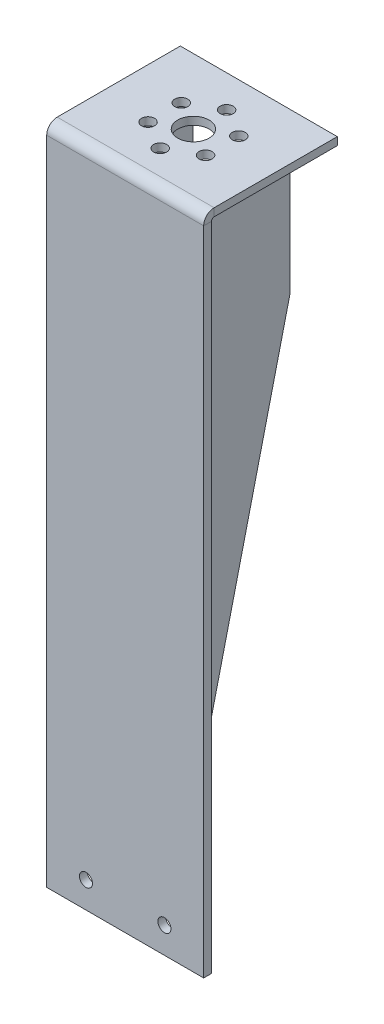
ISO-10303-21;
HEADER;
FILE_DESCRIPTION(('STEP AP214'),'2;1');
FILE_NAME('part.step','',(''),(''),'','','');
FILE_SCHEMA(('AUTOMOTIVE_DESIGN { 1 0 10303 214 1 1 1 1 }'));
ENDSEC;
DATA;
#1=APPLICATION_CONTEXT('core data for automotive mechanical design processes');
#2=APPLICATION_PROTOCOL_DEFINITION('international standard','automotive_design',2000,#1);
#3=PRODUCT_CONTEXT('',#1,'mechanical');
#4=PRODUCT('Part','Part','',(#3));
#5=PRODUCT_RELATED_PRODUCT_CATEGORY('part','',(#4));
#6=PRODUCT_DEFINITION_FORMATION('','',#4);
#7=PRODUCT_DEFINITION_CONTEXT('part definition',#1,'design');
#8=PRODUCT_DEFINITION('design','',#6,#7);
#9=PRODUCT_DEFINITION_SHAPE('','',#8);
#10=(LENGTH_UNIT() NAMED_UNIT(*) SI_UNIT(.MILLI.,.METRE.));
#11=(NAMED_UNIT(*) PLANE_ANGLE_UNIT() SI_UNIT($,.RADIAN.));
#12=(NAMED_UNIT(*) SI_UNIT($,.STERADIAN.) SOLID_ANGLE_UNIT());
#13=UNCERTAINTY_MEASURE_WITH_UNIT(LENGTH_MEASURE(1.E-05),#10,'distance_accuracy_value','');
#14=(GEOMETRIC_REPRESENTATION_CONTEXT(3) GLOBAL_UNCERTAINTY_ASSIGNED_CONTEXT((#13)) GLOBAL_UNIT_ASSIGNED_CONTEXT((#10,
#11,#12)) REPRESENTATION_CONTEXT('',''));
#15=CARTESIAN_POINT('',(0.,0.,0.));
#16=DIRECTION('',(0.,0.,1.));
#17=DIRECTION('',(1.,0.,0.));
#18=AXIS2_PLACEMENT_3D('',#15,#16,#17);
#19=CARTESIAN_POINT('',(0.,100.,-40.));
#20=DIRECTION('',(0.,0.,1.));
#21=DIRECTION('',(0.,-1.,0.));
#22=AXIS2_PLACEMENT_3D('',#19,#20,#21);
#23=PLANE('',#22);
#24=DIRECTION('',(0.,-1.,0.));
#25=VECTOR('',#24,1.);
#26=CARTESIAN_POINT('',(-17.,152.497618993627,-40.));
#27=LINE('',#26,#25);
#28=CARTESIAN_POINT('',(-17.,99.9999999999999,-40.));
#29=VERTEX_POINT('',#28);
#30=CARTESIAN_POINT('',(-17.,50.,-40.));
#31=VERTEX_POINT('',#30);
#32=EDGE_CURVE('E176',#29,#31,#27,.T.);
#33=ORIENTED_EDGE('',*,*,#32,.T.);
#34=DIRECTION('',(1.,0.,0.));
#35=VECTOR('',#34,1.);
#36=CARTESIAN_POINT('',(0.,50.0000000000001,-40.));
#37=LINE('',#36,#35);
#38=CARTESIAN_POINT('',(-20.,50.,-40.));
#39=VERTEX_POINT('',#38);
#40=EDGE_CURVE('E221',#39,#31,#37,.T.);
#41=ORIENTED_EDGE('',*,*,#40,.F.);
#42=DIRECTION('',(0.,1.,0.));
#43=VECTOR('',#42,1.);
#44=CARTESIAN_POINT('',(-20.,-23.5,-40.));
#45=LINE('',#44,#43);
#46=CARTESIAN_POINT('',(-20.,99.9999999999999,-40.));
#47=VERTEX_POINT('',#46);
#48=EDGE_CURVE('E214',#47,#39,#45,.F.);
#49=ORIENTED_EDGE('',*,*,#48,.F.);
#50=DIRECTION('',(1.,0.,0.));
#51=VECTOR('',#50,1.);
#52=CARTESIAN_POINT('',(0.,99.9999999999999,-40.));
#53=LINE('',#52,#51);
#54=EDGE_CURVE('E237',#29,#47,#53,.F.);
#55=ORIENTED_EDGE('',*,*,#54,.F.);
#56=EDGE_LOOP('',(#33,#41,#49,#55));
#57=FACE_BOUND('',#56,.T.);
#58=ADVANCED_FACE('F39',(#57),#23,.F.);
#59=CARTESIAN_POINT('',(0.,-74.9999999999999,-10.));
#60=DIRECTION('',(0.,1.,0.));
#61=DIRECTION('',(0.,0.,1.));
#62=AXIS2_PLACEMENT_3D('',#59,#60,#61);
#63=PLANE('',#62);
#64=DIRECTION('',(0.,0.,-1.));
#65=VECTOR('',#64,1.);
#66=CARTESIAN_POINT('',(-17.,-74.9999999999999,-40.));
#67=LINE('',#66,#65);
#68=CARTESIAN_POINT('',(-17.,-74.9999999999999,0.));
#69=VERTEX_POINT('',#68);
#70=CARTESIAN_POINT('',(-17.,-74.9999999999999,-10.));
#71=VERTEX_POINT('',#70);
#72=EDGE_CURVE('E192',#69,#71,#67,.T.);
#73=ORIENTED_EDGE('',*,*,#72,.F.);
#74=DIRECTION('',(-1.,0.,0.));
#75=VECTOR('',#74,1.);
#76=CARTESIAN_POINT('',(0.,-74.9999999999999,0.));
#77=LINE('',#76,#75);
#78=CARTESIAN_POINT('',(-20.,-74.9999999999999,0.));
#79=VERTEX_POINT('',#78);
#80=EDGE_CURVE('E187',#79,#69,#77,.F.);
#81=ORIENTED_EDGE('',*,*,#80,.F.);
#82=DIRECTION('',(0.,0.,-1.));
#83=VECTOR('',#82,1.);
#84=CARTESIAN_POINT('',(-20.,-74.9999999999999,-22.5365045915064));
#85=LINE('',#84,#83);
#86=CARTESIAN_POINT('',(-20.,-74.9999999999999,-10.));
#87=VERTEX_POINT('',#86);
#88=EDGE_CURVE('E203',#87,#79,#85,.F.);
#89=ORIENTED_EDGE('',*,*,#88,.F.);
#90=DIRECTION('',(1.,0.,0.));
#91=VECTOR('',#90,1.);
#92=CARTESIAN_POINT('',(0.,-74.9999999999999,-10.));
#93=LINE('',#92,#91);
#94=EDGE_CURVE('E225',#87,#71,#93,.T.);
#95=ORIENTED_EDGE('',*,*,#94,.T.);
#96=EDGE_LOOP('',(#73,#81,#89,#95));
#97=FACE_BOUND('',#96,.T.);
#98=ADVANCED_FACE('F368',(#97),#63,.F.);
#99=CARTESIAN_POINT('',(0.,50.0000000000001,-40.));
#100=DIRECTION('',(0.,0.233372952475324,0.972387301980517));
#101=DIRECTION('',(0.,-0.972387301980517,0.233372952475324));
#102=AXIS2_PLACEMENT_3D('',#99,#100,#101);
#103=PLANE('',#102);
#104=DIRECTION('',(0.,-0.972387301980517,0.233372952475324));
#105=VECTOR('',#104,1.);
#106=CARTESIAN_POINT('',(-17.,50.0000000000001,-40.));
#107=LINE('',#106,#105);
#108=EDGE_CURVE('E12',#71,#31,#107,.F.);
#109=ORIENTED_EDGE('',*,*,#108,.F.);
#110=ORIENTED_EDGE('',*,*,#94,.F.);
#111=DIRECTION('',(0.,-0.972387301980517,0.233372952475324));
#112=VECTOR('',#111,1.);
#113=CARTESIAN_POINT('',(-20.,50.0000000000001,-40.));
#114=LINE('',#113,#112);
#115=EDGE_CURVE('E216',#39,#87,#114,.T.);
#116=ORIENTED_EDGE('',*,*,#115,.F.);
#117=ORIENTED_EDGE('',*,*,#40,.T.);
#118=EDGE_LOOP('',(#109,#110,#116,#117));
#119=FACE_BOUND('',#118,.T.);
#120=ADVANCED_FACE('F371',(#119),#103,.F.);
#121=CARTESIAN_POINT('',(60.2031665020761,99.,-1.));
#122=DIRECTION('',(-1.,0.,0.));
#123=DIRECTION('',(0.,-1.,0.));
#124=AXIS2_PLACEMENT_3D('',#121,#122,#123);
#125=CYLINDRICAL_SURFACE('',#124,1.);
#126=CARTESIAN_POINT('',(-20.,99.,-1.));
#127=DIRECTION('',(1.,0.,0.));
#128=DIRECTION('',(0.,0.,-1.));
#129=AXIS2_PLACEMENT_3D('',#126,#127,#128);
#130=CIRCLE('',#129,1.);
#131=CARTESIAN_POINT('',(-20.,99.0000000000001,0.));
#132=VERTEX_POINT('',#131);
#133=CARTESIAN_POINT('',(-20.,100.,-0.999999999999994));
#134=VERTEX_POINT('',#133);
#135=EDGE_CURVE('E311',#132,#134,#130,.F.);
#136=ORIENTED_EDGE('',*,*,#135,.F.);
#137=DIRECTION('',(-1.,0.,0.));
#138=VECTOR('',#137,1.);
#139=CARTESIAN_POINT('',(0.,99.0000000000001,0.));
#140=LINE('',#139,#138);
#141=CARTESIAN_POINT('',(-30.,99.0000000000001,0.));
#142=VERTEX_POINT('',#141);
#143=EDGE_CURVE('E248',#132,#142,#140,.T.);
#144=ORIENTED_EDGE('',*,*,#143,.T.);
#145=CARTESIAN_POINT('',(-30.,99.,-1.));
#146=DIRECTION('',(-1.,0.,0.));
#147=DIRECTION('',(0.,-1.,0.));
#148=AXIS2_PLACEMENT_3D('',#145,#146,#147);
#149=CIRCLE('',#148,1.);
#150=CARTESIAN_POINT('',(-30.,100.,-1.));
#151=VERTEX_POINT('',#150);
#152=EDGE_CURVE('E245',#151,#142,#149,.F.);
#153=ORIENTED_EDGE('',*,*,#152,.F.);
#154=DIRECTION('',(-1.,0.,0.));
#155=VECTOR('',#154,1.);
#156=CARTESIAN_POINT('',(0.,100.,-1.00000000000001));
#157=LINE('',#156,#155);
#158=EDGE_CURVE('E305',#134,#151,#157,.T.);
#159=ORIENTED_EDGE('',*,*,#158,.F.);
#160=EDGE_LOOP('',(#136,#144,#153,#159));
#161=FACE_BOUND('',#160,.T.);
#162=ADVANCED_FACE('F385',(#161),#125,.F.);
#163=CARTESIAN_POINT('',(0.,100.,101.926990816987));
#164=DIRECTION('',(0.,1.,0.));
#165=DIRECTION('',(1.,0.,0.));
#166=AXIS2_PLACEMENT_3D('',#163,#164,#165);
#167=PLANE('',#166);
#168=CARTESIAN_POINT('',(10.9985226280623,99.9999999999999,-29.4230091830128));
#169=DIRECTION('',(0.,1.,0.));
#170=DIRECTION('',(-0.866025403784433,0.,0.50000000000001));
#171=AXIS2_PLACEMENT_3D('',#168,#169,#170);
#172=CIRCLE('',#171,2.5);
#173=CARTESIAN_POINT('',(8.83345911860118,99.9999999999999,-28.1730091830128));
#174=VERTEX_POINT('',#173);
#175=EDGE_CURVE('E744',#174,#174,#172,.T.);
#176=ORIENTED_EDGE('',*,*,#175,.T.);
#177=EDGE_LOOP('',(#176));
#178=FACE_BOUND('',#177,.T.);
#179=CARTESIAN_POINT('',(10.9985226280624,100.,-16.7230091830128));
#180=DIRECTION('',(0.,1.,0.));
#181=DIRECTION('',(-0.866025403784443,0.,-0.499999999999992));
#182=AXIS2_PLACEMENT_3D('',#179,#180,#181);
#183=CIRCLE('',#182,2.5);
#184=CARTESIAN_POINT('',(8.83345911860128,100.,-17.9730091830128));
#185=VERTEX_POINT('',#184);
#186=EDGE_CURVE('E748',#185,#185,#183,.T.);
#187=ORIENTED_EDGE('',*,*,#186,.T.);
#188=EDGE_LOOP('',(#187));
#189=FACE_BOUND('',#188,.T.);
#190=CARTESIAN_POINT('',(0.,100.,-10.3730091830127));
#191=DIRECTION('',(0.,1.,0.));
#192=DIRECTION('',(0.,0.,-1.));
#193=AXIS2_PLACEMENT_3D('',#190,#191,#192);
#194=CIRCLE('',#193,2.5);
#195=CARTESIAN_POINT('',(0.,100.,-12.8730091830127));
#196=VERTEX_POINT('',#195);
#197=EDGE_CURVE('E757',#196,#196,#194,.T.);
#198=ORIENTED_EDGE('',*,*,#197,.T.);
#199=EDGE_LOOP('',(#198));
#200=FACE_BOUND('',#199,.T.);
#201=CARTESIAN_POINT('',(-10.9985226280624,100.,-16.7230091830127));
#202=DIRECTION('',(0.,1.,0.));
#203=DIRECTION('',(0.866025403784436,0.,-0.500000000000004));
#204=AXIS2_PLACEMENT_3D('',#201,#202,#203);
#205=CIRCLE('',#204,2.5);
#206=CARTESIAN_POINT('',(-8.83345911860128,100.,-17.9730091830127));
#207=VERTEX_POINT('',#206);
#208=EDGE_CURVE('E763',#207,#207,#205,.T.);
#209=ORIENTED_EDGE('',*,*,#208,.T.);
#210=EDGE_LOOP('',(#209));
#211=FACE_BOUND('',#210,.T.);
#212=CARTESIAN_POINT('',(-10.9985226280624,99.9999999999999,-29.4230091830127));
#213=DIRECTION('',(0.,1.,0.));
#214=DIRECTION('',(0.86602540378444,0.,0.499999999999998));
#215=AXIS2_PLACEMENT_3D('',#212,#213,#214);
#216=CIRCLE('',#215,2.5);
#217=CARTESIAN_POINT('',(-8.83345911860131,99.9999999999999,-28.1730091830127));
#218=VERTEX_POINT('',#217);
#219=EDGE_CURVE('E769',#218,#218,#216,.T.);
#220=ORIENTED_EDGE('',*,*,#219,.T.);
#221=EDGE_LOOP('',(#220));
#222=FACE_BOUND('',#221,.T.);
#223=CARTESIAN_POINT('',(0.,99.9999999999999,-35.7730091830127));
#224=DIRECTION('',(0.,1.,0.));
#225=DIRECTION('',(0.,0.,1.));
#226=AXIS2_PLACEMENT_3D('',#223,#224,#225);
#227=CIRCLE('',#226,2.5);
#228=CARTESIAN_POINT('',(0.,99.9999999999999,-33.2730091830127));
#229=VERTEX_POINT('',#228);
#230=EDGE_CURVE('E776',#229,#229,#227,.T.);
#231=ORIENTED_EDGE('',*,*,#230,.T.);
#232=EDGE_LOOP('',(#231));
#233=FACE_BOUND('',#232,.T.);
#234=CARTESIAN_POINT('',(0.,100.,-23.0730091830127));
#235=DIRECTION('',(0.,1.,0.));
#236=DIRECTION('',(0.,0.,1.));
#237=AXIS2_PLACEMENT_3D('',#234,#235,#236);
#238=CIRCLE('',#237,6.);
#239=CARTESIAN_POINT('',(0.,100.,-17.0730091830127));
#240=VERTEX_POINT('',#239);
#241=EDGE_CURVE('E782',#240,#240,#238,.T.);
#242=ORIENTED_EDGE('',*,*,#241,.T.);
#243=EDGE_LOOP('',(#242));
#244=FACE_BOUND('',#243,.T.);
#245=CARTESIAN_POINT('',(30.,100.,-0.999999999999987));
#246=VERTEX_POINT('',#245);
#247=CARTESIAN_POINT('',(20.,100.,-1.00000000000001));
#248=VERTEX_POINT('',#247);
#249=EDGE_CURVE('E306',#246,#248,#157,.T.);
#250=ORIENTED_EDGE('',*,*,#249,.T.);
#251=DIRECTION('',(0.,0.,-1.));
#252=VECTOR('',#251,1.);
#253=CARTESIAN_POINT('',(20.,100.,101.926990816987));
#254=LINE('',#253,#252);
#255=CARTESIAN_POINT('',(20.,99.9999999999999,-40.));
#256=VERTEX_POINT('',#255);
#257=EDGE_CURVE('E62',#248,#256,#254,.T.);
#258=ORIENTED_EDGE('',*,*,#257,.T.);
#259=CARTESIAN_POINT('',(17.,99.9999999999999,-40.));
#260=VERTEX_POINT('',#259);
#261=EDGE_CURVE('E238',#256,#260,#53,.F.);
#262=ORIENTED_EDGE('',*,*,#261,.T.);
#263=DIRECTION('',(0.,0.,1.));
#264=VECTOR('',#263,1.);
#265=CARTESIAN_POINT('',(17.,99.9999999999999,-39.9999999999998));
#266=LINE('',#265,#264);
#267=CARTESIAN_POINT('',(17.,100.,0.));
#268=VERTEX_POINT('',#267);
#269=EDGE_CURVE('E190',#260,#268,#266,.T.);
#270=ORIENTED_EDGE('',*,*,#269,.T.);
#271=DIRECTION('',(-1.,0.,0.));
#272=VECTOR('',#271,1.);
#273=CARTESIAN_POINT('',(17.,100.,0.));
#274=LINE('',#273,#272);
#275=CARTESIAN_POINT('',(-17.,100.,0.));
#276=VERTEX_POINT('',#275);
#277=EDGE_CURVE('E184',#268,#276,#274,.T.);
#278=ORIENTED_EDGE('',*,*,#277,.T.);
#279=DIRECTION('',(0.,0.,-1.));
#280=VECTOR('',#279,1.);
#281=CARTESIAN_POINT('',(-17.,99.9999999999999,-39.9999999999998));
#282=LINE('',#281,#280);
#283=EDGE_CURVE('E170',#276,#29,#282,.T.);
#284=ORIENTED_EDGE('',*,*,#283,.T.);
#285=ORIENTED_EDGE('',*,*,#54,.T.);
#286=DIRECTION('',(0.,0.,-1.));
#287=VECTOR('',#286,1.);
#288=CARTESIAN_POINT('',(-20.,100.,101.926990816987));
#289=LINE('',#288,#287);
#290=EDGE_CURVE('E231',#134,#47,#289,.T.);
#291=ORIENTED_EDGE('',*,*,#290,.F.);
#292=ORIENTED_EDGE('',*,*,#158,.T.);
#293=DIRECTION('',(0.,0.,-1.));
#294=VECTOR('',#293,1.);
#295=CARTESIAN_POINT('',(-30.,100.,101.926990816987));
#296=LINE('',#295,#294);
#297=CARTESIAN_POINT('',(-30.,99.9999999999999,-48.0730091830127));
#298=VERTEX_POINT('',#297);
#299=EDGE_CURVE('E294',#298,#151,#296,.F.);
#300=ORIENTED_EDGE('',*,*,#299,.F.);
#301=DIRECTION('',(1.,0.,0.));
#302=VECTOR('',#301,1.);
#303=CARTESIAN_POINT('',(0.,99.9999999999999,-48.0730091830127));
#304=LINE('',#303,#302);
#305=CARTESIAN_POINT('',(30.,99.9999999999999,-48.0730091830127));
#306=VERTEX_POINT('',#305);
#307=EDGE_CURVE('E291',#306,#298,#304,.F.);
#308=ORIENTED_EDGE('',*,*,#307,.F.);
#309=DIRECTION('',(0.,0.,-1.));
#310=VECTOR('',#309,1.);
#311=CARTESIAN_POINT('',(30.,100.,101.926990816987));
#312=LINE('',#311,#310);
#313=EDGE_CURVE('E256',#246,#306,#312,.T.);
#314=ORIENTED_EDGE('',*,*,#313,.F.);
#315=EDGE_LOOP('',(#250,#258,#262,#270,#278,#284,#285,#291,#292,#300,#308,#314));
#316=FACE_BOUND('',#315,.T.);
#317=ADVANCED_FACE('F189',(#178,#189,#200,#211,#222,#233,#244,#316),#167,.F.);
#318=CARTESIAN_POINT('',(-30.,103.,-48.0730091830127));
#319=DIRECTION('',(-1.,0.,0.));
#320=DIRECTION('',(0.,0.,1.));
#321=AXIS2_PLACEMENT_3D('',#318,#319,#320);
#322=PLANE('',#321);
#323=DIRECTION('',(0.,-1.,0.));
#324=VECTOR('',#323,1.);
#325=CARTESIAN_POINT('',(-30.,103.,-1.));
#326=LINE('',#325,#324);
#327=CARTESIAN_POINT('',(-30.,103.,-1.00000000000001));
#328=VERTEX_POINT('',#327);
#329=EDGE_CURVE('E302',#328,#151,#326,.T.);
#330=ORIENTED_EDGE('',*,*,#329,.F.);
#331=DIRECTION('',(0.,0.,1.));
#332=VECTOR('',#331,1.);
#333=CARTESIAN_POINT('',(-30.,103.,-48.0730091830127));
#334=LINE('',#333,#332);
#335=CARTESIAN_POINT('',(-30.,103.,-48.0730091830127));
#336=VERTEX_POINT('',#335);
#337=EDGE_CURVE('E289',#336,#328,#334,.T.);
#338=ORIENTED_EDGE('',*,*,#337,.F.);
#339=DIRECTION('',(0.,1.,0.));
#340=VECTOR('',#339,1.);
#341=CARTESIAN_POINT('',(-30.,103.,-48.0730091830127));
#342=LINE('',#341,#340);
#343=EDGE_CURVE('E295',#298,#336,#342,.T.);
#344=ORIENTED_EDGE('',*,*,#343,.F.);
#345=ORIENTED_EDGE('',*,*,#299,.T.);
#346=EDGE_LOOP('',(#330,#338,#344,#345));
#347=FACE_BOUND('',#346,.T.);
#348=ADVANCED_FACE('F380',(#347),#322,.T.);
#349=CARTESIAN_POINT('',(30.,103.,-48.0730091830127));
#350=DIRECTION('',(1.,0.,0.));
#351=DIRECTION('',(0.,0.,-1.));
#352=AXIS2_PLACEMENT_3D('',#349,#350,#351);
#353=PLANE('',#352);
#354=DIRECTION('',(0.,1.,0.));
#355=VECTOR('',#354,1.);
#356=CARTESIAN_POINT('',(30.,103.,-1.));
#357=LINE('',#356,#355);
#358=CARTESIAN_POINT('',(30.,103.,-1.));
#359=VERTEX_POINT('',#358);
#360=EDGE_CURVE('E308',#246,#359,#357,.T.);
#361=ORIENTED_EDGE('',*,*,#360,.F.);
#362=ORIENTED_EDGE('',*,*,#313,.T.);
#363=DIRECTION('',(0.,1.,0.));
#364=VECTOR('',#363,1.);
#365=CARTESIAN_POINT('',(30.,103.,-48.0730091830127));
#366=LINE('',#365,#364);
#367=CARTESIAN_POINT('',(30.,103.,-48.0730091830127));
#368=VERTEX_POINT('',#367);
#369=EDGE_CURVE('E298',#306,#368,#366,.T.);
#370=ORIENTED_EDGE('',*,*,#369,.T.);
#371=DIRECTION('',(0.,0.,-1.));
#372=VECTOR('',#371,1.);
#373=CARTESIAN_POINT('',(30.,103.,-48.0730091830127));
#374=LINE('',#373,#372);
#375=EDGE_CURVE('E290',#359,#368,#374,.T.);
#376=ORIENTED_EDGE('',*,*,#375,.F.);
#377=EDGE_LOOP('',(#361,#362,#370,#376));
#378=FACE_BOUND('',#377,.T.);
#379=ADVANCED_FACE('F41',(#378),#353,.T.);
#380=CARTESIAN_POINT('',(-30.,103.,-48.0730091830127));
#381=DIRECTION('',(0.,0.,-1.));
#382=DIRECTION('',(-1.,0.,0.));
#383=AXIS2_PLACEMENT_3D('',#380,#381,#382);
#384=PLANE('',#383);
#385=ORIENTED_EDGE('',*,*,#307,.T.);
#386=ORIENTED_EDGE('',*,*,#343,.T.);
#387=DIRECTION('',(-1.,0.,0.));
#388=VECTOR('',#387,1.);
#389=CARTESIAN_POINT('',(-30.,103.,-48.0730091830127));
#390=LINE('',#389,#388);
#391=EDGE_CURVE('E286',#368,#336,#390,.T.);
#392=ORIENTED_EDGE('',*,*,#391,.F.);
#393=ORIENTED_EDGE('',*,*,#369,.F.);
#394=EDGE_LOOP('',(#385,#386,#392,#393));
#395=FACE_BOUND('',#394,.T.);
#396=ADVANCED_FACE('F449',(#395),#384,.T.);
#397=CARTESIAN_POINT('',(0.,103.,101.926990816987));
#398=DIRECTION('',(0.,1.,0.));
#399=DIRECTION('',(1.,0.,0.));
#400=AXIS2_PLACEMENT_3D('',#397,#398,#399);
#401=PLANE('',#400);
#402=CARTESIAN_POINT('',(10.9985226280623,103.,-29.4230091830129));
#403=DIRECTION('',(0.,1.,0.));
#404=DIRECTION('',(-0.866025403784433,0.,0.50000000000001));
#405=AXIS2_PLACEMENT_3D('',#402,#403,#404);
#406=CIRCLE('',#405,2.5);
#407=CARTESIAN_POINT('',(8.83345911860118,103.,-28.1730091830128));
#408=VERTEX_POINT('',#407);
#409=EDGE_CURVE('E747',#408,#408,#406,.T.);
#410=ORIENTED_EDGE('',*,*,#409,.F.);
#411=EDGE_LOOP('',(#410));
#412=FACE_BOUND('',#411,.T.);
#413=CARTESIAN_POINT('',(10.9985226280624,103.,-16.7230091830128));
#414=DIRECTION('',(0.,1.,0.));
#415=DIRECTION('',(-0.866025403784443,0.,-0.499999999999992));
#416=AXIS2_PLACEMENT_3D('',#413,#414,#415);
#417=CIRCLE('',#416,2.5);
#418=CARTESIAN_POINT('',(8.83345911860128,103.,-17.9730091830128));
#419=VERTEX_POINT('',#418);
#420=EDGE_CURVE('E751',#419,#419,#417,.T.);
#421=ORIENTED_EDGE('',*,*,#420,.F.);
#422=EDGE_LOOP('',(#421));
#423=FACE_BOUND('',#422,.T.);
#424=CARTESIAN_POINT('',(0.,103.,-10.3730091830127));
#425=DIRECTION('',(0.,1.,0.));
#426=DIRECTION('',(0.,0.,-1.));
#427=AXIS2_PLACEMENT_3D('',#424,#425,#426);
#428=CIRCLE('',#427,2.5);
#429=CARTESIAN_POINT('',(0.,103.,-12.8730091830127));
#430=VERTEX_POINT('',#429);
#431=EDGE_CURVE('E760',#430,#430,#428,.T.);
#432=ORIENTED_EDGE('',*,*,#431,.F.);
#433=EDGE_LOOP('',(#432));
#434=FACE_BOUND('',#433,.T.);
#435=CARTESIAN_POINT('',(-10.9985226280624,103.,-16.7230091830127));
#436=DIRECTION('',(0.,1.,0.));
#437=DIRECTION('',(0.866025403784436,0.,-0.500000000000004));
#438=AXIS2_PLACEMENT_3D('',#435,#436,#437);
#439=CIRCLE('',#438,2.5);
#440=CARTESIAN_POINT('',(-8.83345911860128,103.,-17.9730091830127));
#441=VERTEX_POINT('',#440);
#442=EDGE_CURVE('E766',#441,#441,#439,.T.);
#443=ORIENTED_EDGE('',*,*,#442,.F.);
#444=EDGE_LOOP('',(#443));
#445=FACE_BOUND('',#444,.T.);
#446=CARTESIAN_POINT('',(-10.9985226280624,103.,-29.4230091830127));
#447=DIRECTION('',(0.,1.,0.));
#448=DIRECTION('',(0.86602540378444,0.,0.499999999999998));
#449=AXIS2_PLACEMENT_3D('',#446,#447,#448);
#450=CIRCLE('',#449,2.5);
#451=CARTESIAN_POINT('',(-8.83345911860131,103.,-28.1730091830127));
#452=VERTEX_POINT('',#451);
#453=EDGE_CURVE('E772',#452,#452,#450,.T.);
#454=ORIENTED_EDGE('',*,*,#453,.F.);
#455=EDGE_LOOP('',(#454));
#456=FACE_BOUND('',#455,.T.);
#457=CARTESIAN_POINT('',(0.,103.,-35.7730091830127));
#458=DIRECTION('',(0.,1.,0.));
#459=DIRECTION('',(0.,0.,1.));
#460=AXIS2_PLACEMENT_3D('',#457,#458,#459);
#461=CIRCLE('',#460,2.5);
#462=CARTESIAN_POINT('',(0.,103.,-33.2730091830127));
#463=VERTEX_POINT('',#462);
#464=EDGE_CURVE('E775',#463,#463,#461,.T.);
#465=ORIENTED_EDGE('',*,*,#464,.F.);
#466=EDGE_LOOP('',(#465));
#467=FACE_BOUND('',#466,.T.);
#468=CARTESIAN_POINT('',(0.,103.,-23.0730091830127));
#469=DIRECTION('',(0.,1.,0.));
#470=DIRECTION('',(0.,0.,1.));
#471=AXIS2_PLACEMENT_3D('',#468,#469,#470);
#472=CIRCLE('',#471,6.);
#473=CARTESIAN_POINT('',(0.,103.,-17.0730091830127));
#474=VERTEX_POINT('',#473);
#475=EDGE_CURVE('E779',#474,#474,#472,.T.);
#476=ORIENTED_EDGE('',*,*,#475,.F.);
#477=EDGE_LOOP('',(#476));
#478=FACE_BOUND('',#477,.T.);
#479=ORIENTED_EDGE('',*,*,#337,.T.);
#480=DIRECTION('',(-1.,0.,0.));
#481=VECTOR('',#480,1.);
#482=CARTESIAN_POINT('',(0.,103.,-1.));
#483=LINE('',#482,#481);
#484=EDGE_CURVE('E297',#359,#328,#483,.T.);
#485=ORIENTED_EDGE('',*,*,#484,.F.);
#486=ORIENTED_EDGE('',*,*,#375,.T.);
#487=ORIENTED_EDGE('',*,*,#391,.T.);
#488=EDGE_LOOP('',(#479,#485,#486,#487));
#489=FACE_BOUND('',#488,.T.);
#490=ADVANCED_FACE('F424',(#412,#423,#434,#445,#456,#467,#478,#489),#401,.T.);
#491=CARTESIAN_POINT('',(-30.,-150.,3.));
#492=DIRECTION('',(0.,-1.,0.));
#493=DIRECTION('',(1.,0.,0.));
#494=AXIS2_PLACEMENT_3D('',#491,#492,#493);
#495=PLANE('',#494);
#496=DIRECTION('',(0.,0.,1.));
#497=VECTOR('',#496,1.);
#498=CARTESIAN_POINT('',(-30.,-150.,3.));
#499=LINE('',#498,#497);
#500=CARTESIAN_POINT('',(-30.,-150.,0.));
#501=VERTEX_POINT('',#500);
#502=CARTESIAN_POINT('',(-30.,-150.,3.));
#503=VERTEX_POINT('',#502);
#504=EDGE_CURVE('E260',#501,#503,#499,.T.);
#505=ORIENTED_EDGE('',*,*,#504,.F.);
#506=DIRECTION('',(1.,0.,0.));
#507=VECTOR('',#506,1.);
#508=CARTESIAN_POINT('',(0.,-150.,0.));
#509=LINE('',#508,#507);
#510=CARTESIAN_POINT('',(30.,-150.,0.));
#511=VERTEX_POINT('',#510);
#512=EDGE_CURVE('E280',#501,#511,#509,.T.);
#513=ORIENTED_EDGE('',*,*,#512,.T.);
#514=DIRECTION('',(0.,0.,1.));
#515=VECTOR('',#514,1.);
#516=CARTESIAN_POINT('',(30.,-150.,3.));
#517=LINE('',#516,#515);
#518=CARTESIAN_POINT('',(30.,-150.,3.));
#519=VERTEX_POINT('',#518);
#520=EDGE_CURVE('E278',#511,#519,#517,.T.);
#521=ORIENTED_EDGE('',*,*,#520,.T.);
#522=DIRECTION('',(1.,0.,0.));
#523=VECTOR('',#522,1.);
#524=CARTESIAN_POINT('',(-30.,-150.,3.));
#525=LINE('',#524,#523);
#526=EDGE_CURVE('E268',#503,#519,#525,.T.);
#527=ORIENTED_EDGE('',*,*,#526,.F.);
#528=EDGE_LOOP('',(#505,#513,#521,#527));
#529=FACE_BOUND('',#528,.T.);
#530=ADVANCED_FACE('F354',(#529),#495,.T.);
#531=CARTESIAN_POINT('',(0.,0.,3.));
#532=DIRECTION('',(0.,0.,1.));
#533=DIRECTION('',(1.,0.,0.));
#534=AXIS2_PLACEMENT_3D('',#531,#532,#533);
#535=PLANE('',#534);
#536=CARTESIAN_POINT('',(15.,-140.,3.));
#537=DIRECTION('',(0.,0.,1.));
#538=DIRECTION('',(1.,0.,0.));
#539=AXIS2_PLACEMENT_3D('',#536,#537,#538);
#540=CIRCLE('',#539,2.5);
#541=CARTESIAN_POINT('',(17.5,-140.,3.));
#542=VERTEX_POINT('',#541);
#543=EDGE_CURVE('E785',#542,#542,#540,.T.);
#544=ORIENTED_EDGE('',*,*,#543,.F.);
#545=EDGE_LOOP('',(#544));
#546=FACE_BOUND('',#545,.T.);
#547=CARTESIAN_POINT('',(-15.,-140.,3.));
#548=DIRECTION('',(0.,0.,1.));
#549=DIRECTION('',(1.,0.,0.));
#550=AXIS2_PLACEMENT_3D('',#547,#548,#549);
#551=CIRCLE('',#550,2.5);
#552=CARTESIAN_POINT('',(-12.5,-140.,3.));
#553=VERTEX_POINT('',#552);
#554=EDGE_CURVE('E791',#553,#553,#551,.T.);
#555=ORIENTED_EDGE('',*,*,#554,.F.);
#556=EDGE_LOOP('',(#555));
#557=FACE_BOUND('',#556,.T.);
#558=DIRECTION('',(-1.,0.,0.));
#559=VECTOR('',#558,1.);
#560=CARTESIAN_POINT('',(0.,99.,3.));
#561=LINE('',#560,#559);
#562=CARTESIAN_POINT('',(30.,99.,2.99999999999999));
#563=VERTEX_POINT('',#562);
#564=CARTESIAN_POINT('',(-30.,99.,2.99999999999999));
#565=VERTEX_POINT('',#564);
#566=EDGE_CURVE('E273',#563,#565,#561,.T.);
#567=ORIENTED_EDGE('',*,*,#566,.T.);
#568=DIRECTION('',(0.,-1.,0.));
#569=VECTOR('',#568,1.);
#570=CARTESIAN_POINT('',(-30.,150.,3.));
#571=LINE('',#570,#569);
#572=EDGE_CURVE('E271',#565,#503,#571,.T.);
#573=ORIENTED_EDGE('',*,*,#572,.T.);
#574=ORIENTED_EDGE('',*,*,#526,.T.);
#575=DIRECTION('',(0.,1.,0.));
#576=VECTOR('',#575,1.);
#577=CARTESIAN_POINT('',(30.,150.,3.));
#578=LINE('',#577,#576);
#579=EDGE_CURVE('E275',#519,#563,#578,.T.);
#580=ORIENTED_EDGE('',*,*,#579,.T.);
#581=EDGE_LOOP('',(#567,#573,#574,#580));
#582=FACE_BOUND('',#581,.T.);
#583=ADVANCED_FACE('F430',(#546,#557,#582),#535,.T.);
#584=CARTESIAN_POINT('',(-30.,150.,3.));
#585=DIRECTION('',(-1.,0.,0.));
#586=DIRECTION('',(0.,-1.,0.));
#587=AXIS2_PLACEMENT_3D('',#584,#585,#586);
#588=PLANE('',#587);
#589=ORIENTED_EDGE('',*,*,#572,.F.);
#590=DIRECTION('',(0.,0.,-1.));
#591=VECTOR('',#590,1.);
#592=CARTESIAN_POINT('',(-30.,99.,2.99999999999964));
#593=LINE('',#592,#591);
#594=EDGE_CURVE('E265',#565,#142,#593,.T.);
#595=ORIENTED_EDGE('',*,*,#594,.T.);
#596=DIRECTION('',(0.,1.,0.));
#597=VECTOR('',#596,1.);
#598=CARTESIAN_POINT('',(-30.,0.,0.));
#599=LINE('',#598,#597);
#600=EDGE_CURVE('E263',#142,#501,#599,.F.);
#601=ORIENTED_EDGE('',*,*,#600,.T.);
#602=ORIENTED_EDGE('',*,*,#504,.T.);
#603=EDGE_LOOP('',(#589,#595,#601,#602));
#604=FACE_BOUND('',#603,.T.);
#605=ADVANCED_FACE('F358',(#604),#588,.T.);
#606=CARTESIAN_POINT('',(0.,0.,0.));
#607=DIRECTION('',(0.,0.,1.));
#608=DIRECTION('',(1.,0.,0.));
#609=AXIS2_PLACEMENT_3D('',#606,#607,#608);
#610=PLANE('',#609);
#611=CARTESIAN_POINT('',(15.,-140.,0.));
#612=DIRECTION('',(0.,0.,1.));
#613=DIRECTION('',(1.,0.,0.));
#614=AXIS2_PLACEMENT_3D('',#611,#612,#613);
#615=CIRCLE('',#614,2.5);
#616=CARTESIAN_POINT('',(17.5,-140.,0.));
#617=VERTEX_POINT('',#616);
#618=EDGE_CURVE('E788',#617,#617,#615,.T.);
#619=ORIENTED_EDGE('',*,*,#618,.T.);
#620=EDGE_LOOP('',(#619));
#621=FACE_BOUND('',#620,.T.);
#622=CARTESIAN_POINT('',(-15.,-140.,0.));
#623=DIRECTION('',(0.,0.,1.));
#624=DIRECTION('',(1.,0.,0.));
#625=AXIS2_PLACEMENT_3D('',#622,#623,#624);
#626=CIRCLE('',#625,2.5);
#627=CARTESIAN_POINT('',(-12.5,-140.,0.));
#628=VERTEX_POINT('',#627);
#629=EDGE_CURVE('E332',#628,#628,#626,.T.);
#630=ORIENTED_EDGE('',*,*,#629,.T.);
#631=EDGE_LOOP('',(#630));
#632=FACE_BOUND('',#631,.T.);
#633=ORIENTED_EDGE('',*,*,#80,.T.);
#634=DIRECTION('',(0.,-1.,0.));
#635=VECTOR('',#634,1.);
#636=CARTESIAN_POINT('',(-17.,152.497618993627,0.));
#637=LINE('',#636,#635);
#638=EDGE_CURVE('E173',#276,#69,#637,.T.);
#639=ORIENTED_EDGE('',*,*,#638,.F.);
#640=ORIENTED_EDGE('',*,*,#277,.F.);
#641=DIRECTION('',(0.,-1.,0.));
#642=VECTOR('',#641,1.);
#643=CARTESIAN_POINT('',(17.,152.497618993627,0.));
#644=LINE('',#643,#642);
#645=CARTESIAN_POINT('',(17.,-74.9999999999999,0.));
#646=VERTEX_POINT('',#645);
#647=EDGE_CURVE('E198',#268,#646,#644,.T.);
#648=ORIENTED_EDGE('',*,*,#647,.T.);
#649=CARTESIAN_POINT('',(20.,-74.9999999999999,0.));
#650=VERTEX_POINT('',#649);
#651=EDGE_CURVE('E322',#646,#650,#77,.F.);
#652=ORIENTED_EDGE('',*,*,#651,.T.);
#653=DIRECTION('',(0.,1.,0.));
#654=VECTOR('',#653,1.);
#655=CARTESIAN_POINT('',(20.,0.,0.));
#656=LINE('',#655,#654);
#657=CARTESIAN_POINT('',(20.,99.0000000000001,0.));
#658=VERTEX_POINT('',#657);
#659=EDGE_CURVE('E234',#650,#658,#656,.T.);
#660=ORIENTED_EDGE('',*,*,#659,.T.);
#661=CARTESIAN_POINT('',(30.,99.,0.));
#662=VERTEX_POINT('',#661);
#663=EDGE_CURVE('E283',#662,#658,#140,.T.);
#664=ORIENTED_EDGE('',*,*,#663,.F.);
#665=DIRECTION('',(0.,1.,0.));
#666=VECTOR('',#665,1.);
#667=CARTESIAN_POINT('',(30.,0.,0.));
#668=LINE('',#667,#666);
#669=EDGE_CURVE('E257',#511,#662,#668,.T.);
#670=ORIENTED_EDGE('',*,*,#669,.F.);
#671=ORIENTED_EDGE('',*,*,#512,.F.);
#672=ORIENTED_EDGE('',*,*,#600,.F.);
#673=ORIENTED_EDGE('',*,*,#143,.F.);
#674=DIRECTION('',(0.,1.,0.));
#675=VECTOR('',#674,1.);
#676=CARTESIAN_POINT('',(-20.,0.,0.));
#677=LINE('',#676,#675);
#678=EDGE_CURVE('E228',#79,#132,#677,.T.);
#679=ORIENTED_EDGE('',*,*,#678,.F.);
#680=EDGE_LOOP('',(#633,#639,#640,#648,#652,#660,#664,#670,#671,#672,#673,#679));
#681=FACE_BOUND('',#680,.T.);
#682=ADVANCED_FACE('F182',(#621,#632,#681),#610,.F.);
#683=CARTESIAN_POINT('',(30.,150.,3.));
#684=DIRECTION('',(1.,0.,0.));
#685=DIRECTION('',(0.,1.,0.));
#686=AXIS2_PLACEMENT_3D('',#683,#684,#685);
#687=PLANE('',#686);
#688=ORIENTED_EDGE('',*,*,#669,.T.);
#689=DIRECTION('',(0.,0.,1.));
#690=VECTOR('',#689,1.);
#691=CARTESIAN_POINT('',(30.,99.,2.99999999999964));
#692=LINE('',#691,#690);
#693=EDGE_CURVE('E253',#662,#563,#692,.T.);
#694=ORIENTED_EDGE('',*,*,#693,.T.);
#695=ORIENTED_EDGE('',*,*,#579,.F.);
#696=ORIENTED_EDGE('',*,*,#520,.F.);
#697=EDGE_LOOP('',(#688,#694,#695,#696));
#698=FACE_BOUND('',#697,.T.);
#699=ADVANCED_FACE('F348',(#698),#687,.T.);
#700=CARTESIAN_POINT('',(30.,99.,-1.));
#701=DIRECTION('',(1.,0.,0.));
#702=DIRECTION('',(0.,0.,-1.));
#703=AXIS2_PLACEMENT_3D('',#700,#701,#702);
#704=PLANE('',#703);
#705=ORIENTED_EDGE('',*,*,#693,.F.);
#706=CARTESIAN_POINT('',(30.,99.,-1.));
#707=DIRECTION('',(-1.,0.,0.));
#708=DIRECTION('',(0.,-1.,0.));
#709=AXIS2_PLACEMENT_3D('',#706,#707,#708);
#710=CIRCLE('',#709,1.);
#711=EDGE_CURVE('E240',#662,#246,#710,.T.);
#712=ORIENTED_EDGE('',*,*,#711,.T.);
#713=ORIENTED_EDGE('',*,*,#360,.T.);
#714=CARTESIAN_POINT('',(30.,99.,-1.));
#715=DIRECTION('',(-1.,0.,0.));
#716=DIRECTION('',(0.,0.,1.));
#717=AXIS2_PLACEMENT_3D('',#714,#715,#716);
#718=CIRCLE('',#717,3.99999999999999);
#719=EDGE_CURVE('E241',#563,#359,#718,.T.);
#720=ORIENTED_EDGE('',*,*,#719,.F.);
#721=EDGE_LOOP('',(#705,#712,#713,#720));
#722=FACE_BOUND('',#721,.T.);
#723=ADVANCED_FACE('F420',(#722),#704,.T.);
#724=CARTESIAN_POINT('',(-30.,99.,-1.));
#725=DIRECTION('',(-1.,0.,0.));
#726=DIRECTION('',(0.,0.,1.));
#727=AXIS2_PLACEMENT_3D('',#724,#725,#726);
#728=PLANE('',#727);
#729=ORIENTED_EDGE('',*,*,#329,.T.);
#730=ORIENTED_EDGE('',*,*,#152,.T.);
#731=ORIENTED_EDGE('',*,*,#594,.F.);
#732=CARTESIAN_POINT('',(-30.,99.,-1.));
#733=DIRECTION('',(1.,0.,0.));
#734=DIRECTION('',(0.,0.,-1.));
#735=AXIS2_PLACEMENT_3D('',#732,#733,#734);
#736=CIRCLE('',#735,3.99999999999999);
#737=EDGE_CURVE('E244',#328,#565,#736,.T.);
#738=ORIENTED_EDGE('',*,*,#737,.F.);
#739=EDGE_LOOP('',(#729,#730,#731,#738));
#740=FACE_BOUND('',#739,.T.);
#741=ADVANCED_FACE('F384',(#740),#728,.T.);
#742=CARTESIAN_POINT('',(60.2031665020761,99.,-1.));
#743=DIRECTION('',(-1.,0.,0.));
#744=DIRECTION('',(0.,-1.,0.));
#745=AXIS2_PLACEMENT_3D('',#742,#743,#744);
#746=CYLINDRICAL_SURFACE('',#745,4.);
#747=ORIENTED_EDGE('',*,*,#484,.T.);
#748=ORIENTED_EDGE('',*,*,#737,.T.);
#749=ORIENTED_EDGE('',*,*,#566,.F.);
#750=ORIENTED_EDGE('',*,*,#719,.T.);
#751=EDGE_LOOP('',(#747,#748,#749,#750));
#752=FACE_BOUND('',#751,.T.);
#753=ADVANCED_FACE('F398',(#752),#746,.T.);
#754=ORIENTED_EDGE('',*,*,#663,.T.);
#755=CARTESIAN_POINT('',(20.,99.,-1.));
#756=DIRECTION('',(1.,0.,0.));
#757=DIRECTION('',(0.,0.,-1.));
#758=AXIS2_PLACEMENT_3D('',#755,#756,#757);
#759=CIRCLE('',#758,1.);
#760=EDGE_CURVE('E320',#658,#248,#759,.F.);
#761=ORIENTED_EDGE('',*,*,#760,.T.);
#762=ORIENTED_EDGE('',*,*,#249,.F.);
#763=ORIENTED_EDGE('',*,*,#711,.F.);
#764=EDGE_LOOP('',(#754,#761,#762,#763));
#765=FACE_BOUND('',#764,.T.);
#766=ADVANCED_FACE('F344',(#765),#125,.F.);
#767=DIRECTION('',(0.,-1.,0.));
#768=VECTOR('',#767,1.);
#769=CARTESIAN_POINT('',(17.,152.497618993627,-40.));
#770=LINE('',#769,#768);
#771=CARTESIAN_POINT('',(17.,50.0000000000001,-40.));
#772=VERTEX_POINT('',#771);
#773=EDGE_CURVE('E54',#260,#772,#770,.T.);
#774=ORIENTED_EDGE('',*,*,#773,.F.);
#775=ORIENTED_EDGE('',*,*,#261,.F.);
#776=DIRECTION('',(0.,1.,0.));
#777=VECTOR('',#776,1.);
#778=CARTESIAN_POINT('',(20.,-23.5,-40.));
#779=LINE('',#778,#777);
#780=CARTESIAN_POINT('',(20.,50.,-40.));
#781=VERTEX_POINT('',#780);
#782=EDGE_CURVE('E204',#256,#781,#779,.F.);
#783=ORIENTED_EDGE('',*,*,#782,.T.);
#784=EDGE_CURVE('E207',#772,#781,#37,.T.);
#785=ORIENTED_EDGE('',*,*,#784,.F.);
#786=EDGE_LOOP('',(#774,#775,#783,#785));
#787=FACE_BOUND('',#786,.T.);
#788=ADVANCED_FACE('F397',(#787),#23,.F.);
#789=DIRECTION('',(0.,0.,1.));
#790=VECTOR('',#789,1.);
#791=CARTESIAN_POINT('',(17.,-74.9999999999999,-40.));
#792=LINE('',#791,#790);
#793=CARTESIAN_POINT('',(17.,-74.9999999999999,-10.));
#794=VERTEX_POINT('',#793);
#795=EDGE_CURVE('E194',#794,#646,#792,.T.);
#796=ORIENTED_EDGE('',*,*,#795,.F.);
#797=CARTESIAN_POINT('',(20.,-74.9999999999999,-10.));
#798=VERTEX_POINT('',#797);
#799=EDGE_CURVE('E224',#794,#798,#93,.T.);
#800=ORIENTED_EDGE('',*,*,#799,.T.);
#801=DIRECTION('',(0.,0.,-1.));
#802=VECTOR('',#801,1.);
#803=CARTESIAN_POINT('',(20.,-74.9999999999999,-22.5365045915064));
#804=LINE('',#803,#802);
#805=EDGE_CURVE('E211',#798,#650,#804,.F.);
#806=ORIENTED_EDGE('',*,*,#805,.T.);
#807=ORIENTED_EDGE('',*,*,#651,.F.);
#808=EDGE_LOOP('',(#796,#800,#806,#807));
#809=FACE_BOUND('',#808,.T.);
#810=ADVANCED_FACE('F330',(#809),#63,.F.);
#811=CARTESIAN_POINT('',(20.,-23.5,-22.5365045915064));
#812=DIRECTION('',(1.,0.,0.));
#813=DIRECTION('',(0.,0.,-1.));
#814=AXIS2_PLACEMENT_3D('',#811,#812,#813);
#815=PLANE('',#814);
#816=ORIENTED_EDGE('',*,*,#257,.F.);
#817=ORIENTED_EDGE('',*,*,#760,.F.);
#818=ORIENTED_EDGE('',*,*,#659,.F.);
#819=ORIENTED_EDGE('',*,*,#805,.F.);
#820=DIRECTION('',(0.,-0.972387301980517,0.233372952475324));
#821=VECTOR('',#820,1.);
#822=CARTESIAN_POINT('',(20.,50.0000000000001,-40.));
#823=LINE('',#822,#821);
#824=EDGE_CURVE('E208',#781,#798,#823,.T.);
#825=ORIENTED_EDGE('',*,*,#824,.F.);
#826=ORIENTED_EDGE('',*,*,#782,.F.);
#827=EDGE_LOOP('',(#816,#817,#818,#819,#825,#826));
#828=FACE_BOUND('',#827,.T.);
#829=ADVANCED_FACE('F337',(#828),#815,.T.);
#830=CARTESIAN_POINT('',(-20.,-23.5,-22.5365045915064));
#831=DIRECTION('',(1.,0.,0.));
#832=DIRECTION('',(0.,0.,-1.));
#833=AXIS2_PLACEMENT_3D('',#830,#831,#832);
#834=PLANE('',#833);
#835=ORIENTED_EDGE('',*,*,#135,.T.);
#836=ORIENTED_EDGE('',*,*,#290,.T.);
#837=ORIENTED_EDGE('',*,*,#48,.T.);
#838=ORIENTED_EDGE('',*,*,#115,.T.);
#839=ORIENTED_EDGE('',*,*,#88,.T.);
#840=ORIENTED_EDGE('',*,*,#678,.T.);
#841=EDGE_LOOP('',(#835,#836,#837,#838,#839,#840));
#842=FACE_BOUND('',#841,.T.);
#843=ADVANCED_FACE('F364',(#842),#834,.F.);
#844=DIRECTION('',(0.,0.972387301980517,-0.233372952475324));
#845=VECTOR('',#844,1.);
#846=CARTESIAN_POINT('',(17.,50.0000000000001,-40.));
#847=LINE('',#846,#845);
#848=EDGE_CURVE('E47',#772,#794,#847,.F.);
#849=ORIENTED_EDGE('',*,*,#848,.F.);
#850=ORIENTED_EDGE('',*,*,#784,.T.);
#851=ORIENTED_EDGE('',*,*,#824,.T.);
#852=ORIENTED_EDGE('',*,*,#799,.F.);
#853=EDGE_LOOP('',(#849,#850,#851,#852));
#854=FACE_BOUND('',#853,.T.);
#855=ADVANCED_FACE('F333',(#854),#103,.F.);
#856=CARTESIAN_POINT('',(-17.,152.497618993627,-40.));
#857=DIRECTION('',(-1.,0.,0.));
#858=DIRECTION('',(0.,0.,1.));
#859=AXIS2_PLACEMENT_3D('',#856,#857,#858);
#860=PLANE('',#859);
#861=ORIENTED_EDGE('',*,*,#108,.T.);
#862=ORIENTED_EDGE('',*,*,#32,.F.);
#863=ORIENTED_EDGE('',*,*,#283,.F.);
#864=ORIENTED_EDGE('',*,*,#638,.T.);
#865=ORIENTED_EDGE('',*,*,#72,.T.);
#866=EDGE_LOOP('',(#861,#862,#863,#864,#865));
#867=FACE_BOUND('',#866,.T.);
#868=ADVANCED_FACE('F172',(#867),#860,.F.);
#869=CARTESIAN_POINT('',(17.,152.497618993627,-40.));
#870=DIRECTION('',(1.,0.,0.));
#871=DIRECTION('',(0.,0.,-1.));
#872=AXIS2_PLACEMENT_3D('',#869,#870,#871);
#873=PLANE('',#872);
#874=ORIENTED_EDGE('',*,*,#848,.T.);
#875=ORIENTED_EDGE('',*,*,#795,.T.);
#876=ORIENTED_EDGE('',*,*,#647,.F.);
#877=ORIENTED_EDGE('',*,*,#269,.F.);
#878=ORIENTED_EDGE('',*,*,#773,.T.);
#879=EDGE_LOOP('',(#874,#875,#876,#877,#878));
#880=FACE_BOUND('',#879,.T.);
#881=ADVANCED_FACE('F324',(#880),#873,.F.);
#882=CARTESIAN_POINT('',(-15.,-140.,0.));
#883=DIRECTION('',(0.,0.,1.));
#884=DIRECTION('',(1.,0.,0.));
#885=AXIS2_PLACEMENT_3D('',#882,#883,#884);
#886=CYLINDRICAL_SURFACE('',#885,2.5);
#887=ORIENTED_EDGE('',*,*,#629,.F.);
#888=EDGE_LOOP('',(#887));
#889=FACE_BOUND('',#888,.T.);
#890=ORIENTED_EDGE('',*,*,#554,.T.);
#891=EDGE_LOOP('',(#890));
#892=FACE_BOUND('',#891,.T.);
#893=ADVANCED_FACE('F584',(#889,#892),#886,.F.);
#894=CARTESIAN_POINT('',(15.,-140.,0.));
#895=DIRECTION('',(0.,0.,1.));
#896=DIRECTION('',(1.,0.,0.));
#897=AXIS2_PLACEMENT_3D('',#894,#895,#896);
#898=CYLINDRICAL_SURFACE('',#897,2.5);
#899=ORIENTED_EDGE('',*,*,#618,.F.);
#900=EDGE_LOOP('',(#899));
#901=FACE_BOUND('',#900,.T.);
#902=ORIENTED_EDGE('',*,*,#543,.T.);
#903=EDGE_LOOP('',(#902));
#904=FACE_BOUND('',#903,.T.);
#905=ADVANCED_FACE('F604',(#901,#904),#898,.F.);
#906=CARTESIAN_POINT('',(0.,100.,-23.0730091830127));
#907=DIRECTION('',(0.,1.,0.));
#908=DIRECTION('',(0.,0.,1.));
#909=AXIS2_PLACEMENT_3D('',#906,#907,#908);
#910=CYLINDRICAL_SURFACE('',#909,6.);
#911=ORIENTED_EDGE('',*,*,#241,.F.);
#912=EDGE_LOOP('',(#911));
#913=FACE_BOUND('',#912,.T.);
#914=ORIENTED_EDGE('',*,*,#475,.T.);
#915=EDGE_LOOP('',(#914));
#916=FACE_BOUND('',#915,.T.);
#917=ADVANCED_FACE('F614',(#913,#916),#910,.F.);
#918=CARTESIAN_POINT('',(0.,99.9999999999999,-35.7730091830127));
#919=DIRECTION('',(0.,1.,0.));
#920=DIRECTION('',(0.,0.,1.));
#921=AXIS2_PLACEMENT_3D('',#918,#919,#920);
#922=CYLINDRICAL_SURFACE('',#921,2.5);
#923=ORIENTED_EDGE('',*,*,#230,.F.);
#924=EDGE_LOOP('',(#923));
#925=FACE_BOUND('',#924,.T.);
#926=ORIENTED_EDGE('',*,*,#464,.T.);
#927=EDGE_LOOP('',(#926));
#928=FACE_BOUND('',#927,.T.);
#929=ADVANCED_FACE('F624',(#925,#928),#922,.F.);
#930=CARTESIAN_POINT('',(-10.9985226280624,99.9999999999999,-29.4230091830127));
#931=DIRECTION('',(0.,1.,0.));
#932=DIRECTION('',(0.86602540378444,0.,0.499999999999998));
#933=AXIS2_PLACEMENT_3D('',#930,#931,#932);
#934=CYLINDRICAL_SURFACE('',#933,2.5);
#935=ORIENTED_EDGE('',*,*,#219,.F.);
#936=EDGE_LOOP('',(#935));
#937=FACE_BOUND('',#936,.T.);
#938=ORIENTED_EDGE('',*,*,#453,.T.);
#939=EDGE_LOOP('',(#938));
#940=FACE_BOUND('',#939,.T.);
#941=ADVANCED_FACE('F633',(#937,#940),#934,.F.);
#942=CARTESIAN_POINT('',(-10.9985226280624,100.,-16.7230091830127));
#943=DIRECTION('',(0.,1.,0.));
#944=DIRECTION('',(0.866025403784436,0.,-0.500000000000004));
#945=AXIS2_PLACEMENT_3D('',#942,#943,#944);
#946=CYLINDRICAL_SURFACE('',#945,2.5);
#947=ORIENTED_EDGE('',*,*,#208,.F.);
#948=EDGE_LOOP('',(#947));
#949=FACE_BOUND('',#948,.T.);
#950=ORIENTED_EDGE('',*,*,#442,.T.);
#951=EDGE_LOOP('',(#950));
#952=FACE_BOUND('',#951,.T.);
#953=ADVANCED_FACE('F697',(#949,#952),#946,.F.);
#954=CARTESIAN_POINT('',(0.,100.,-10.3730091830127));
#955=DIRECTION('',(0.,1.,0.));
#956=DIRECTION('',(0.,0.,-1.));
#957=AXIS2_PLACEMENT_3D('',#954,#955,#956);
#958=CYLINDRICAL_SURFACE('',#957,2.5);
#959=ORIENTED_EDGE('',*,*,#197,.F.);
#960=EDGE_LOOP('',(#959));
#961=FACE_BOUND('',#960,.T.);
#962=ORIENTED_EDGE('',*,*,#431,.T.);
#963=EDGE_LOOP('',(#962));
#964=FACE_BOUND('',#963,.T.);
#965=ADVANCED_FACE('F704',(#961,#964),#958,.F.);
#966=CARTESIAN_POINT('',(10.9985226280624,100.,-16.7230091830128));
#967=DIRECTION('',(0.,1.,0.));
#968=DIRECTION('',(-0.866025403784443,0.,-0.499999999999992));
#969=AXIS2_PLACEMENT_3D('',#966,#967,#968);
#970=CYLINDRICAL_SURFACE('',#969,2.5);
#971=ORIENTED_EDGE('',*,*,#186,.F.);
#972=EDGE_LOOP('',(#971));
#973=FACE_BOUND('',#972,.T.);
#974=ORIENTED_EDGE('',*,*,#420,.T.);
#975=EDGE_LOOP('',(#974));
#976=FACE_BOUND('',#975,.T.);
#977=ADVANCED_FACE('F712',(#973,#976),#970,.F.);
#978=CARTESIAN_POINT('',(10.9985226280623,99.9999999999999,-29.4230091830128));
#979=DIRECTION('',(0.,1.,0.));
#980=DIRECTION('',(-0.866025403784433,0.,0.50000000000001));
#981=AXIS2_PLACEMENT_3D('',#978,#979,#980);
#982=CYLINDRICAL_SURFACE('',#981,2.5);
#983=ORIENTED_EDGE('',*,*,#175,.F.);
#984=EDGE_LOOP('',(#983));
#985=FACE_BOUND('',#984,.T.);
#986=ORIENTED_EDGE('',*,*,#409,.T.);
#987=EDGE_LOOP('',(#986));
#988=FACE_BOUND('',#987,.T.);
#989=ADVANCED_FACE('F720',(#985,#988),#982,.F.);
#990=CLOSED_SHELL('',(#58,#98,#120,#162,#317,#348,#379,#396,#490,#530,#583,#605,#682,#699,#723,
#741,#753,#766,#788,#810,#829,#843,#855,#868,#881,#893,#905,#917,#929,#941,#953,#965,#977,#989));
#991=MANIFOLD_SOLID_BREP('B2',#990);
#992=ADVANCED_BREP_SHAPE_REPRESENTATION('',(#18,#991),#14);
#993=SHAPE_DEFINITION_REPRESENTATION(#9,#992);
ENDSEC;
END-ISO-10303-21;
